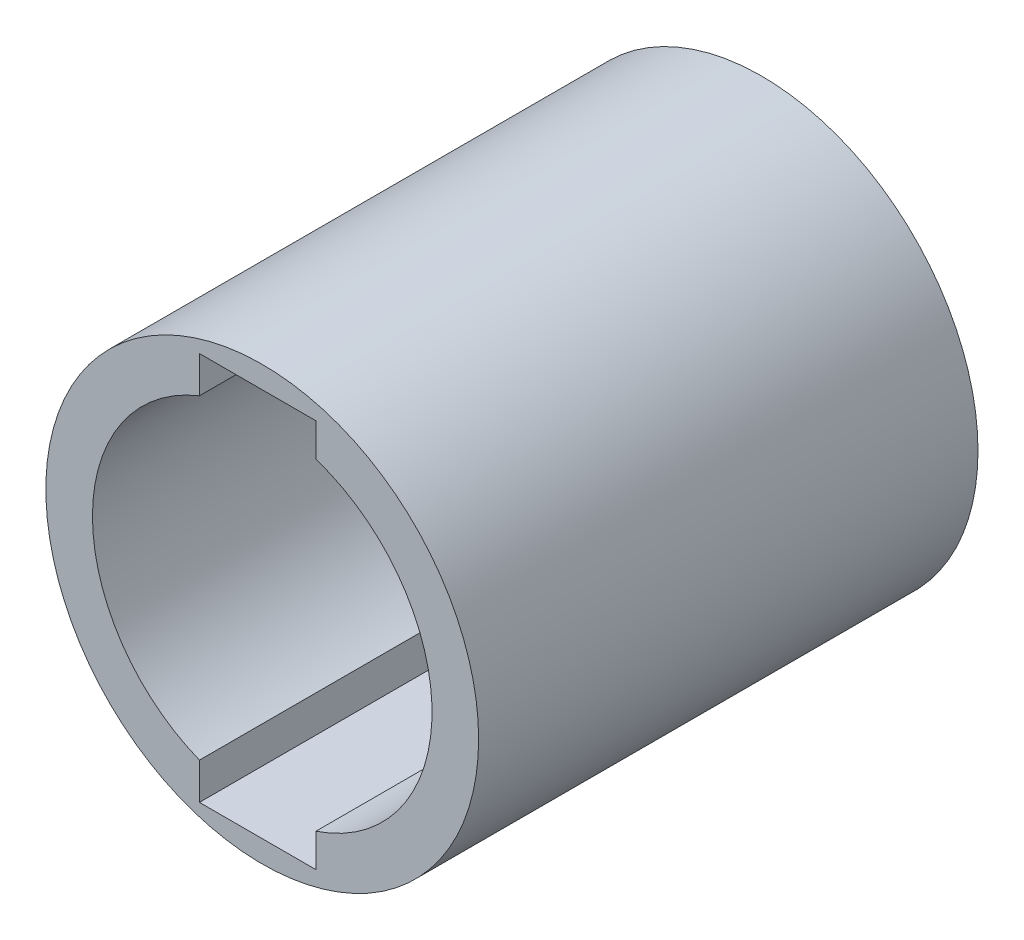
ISO-10303-21;
HEADER;
FILE_DESCRIPTION(('STEP AP214'),'2;1');
FILE_NAME('part.step','',(''),(''),'','','');
FILE_SCHEMA(('AUTOMOTIVE_DESIGN { 1 0 10303 214 1 1 1 1 }'));
ENDSEC;
DATA;
#1=APPLICATION_CONTEXT('core data for automotive mechanical design processes');
#2=APPLICATION_PROTOCOL_DEFINITION('international standard','automotive_design',2000,#1);
#3=PRODUCT_CONTEXT('',#1,'mechanical');
#4=PRODUCT('Part','Part','',(#3));
#5=PRODUCT_RELATED_PRODUCT_CATEGORY('part','',(#4));
#6=PRODUCT_DEFINITION_FORMATION('','',#4);
#7=PRODUCT_DEFINITION_CONTEXT('part definition',#1,'design');
#8=PRODUCT_DEFINITION('design','',#6,#7);
#9=PRODUCT_DEFINITION_SHAPE('','',#8);
#10=(LENGTH_UNIT() NAMED_UNIT(*) SI_UNIT(.MILLI.,.METRE.));
#11=(NAMED_UNIT(*) PLANE_ANGLE_UNIT() SI_UNIT($,.RADIAN.));
#12=(NAMED_UNIT(*) SI_UNIT($,.STERADIAN.) SOLID_ANGLE_UNIT());
#13=UNCERTAINTY_MEASURE_WITH_UNIT(LENGTH_MEASURE(1.E-05),#10,'distance_accuracy_value','');
#14=(GEOMETRIC_REPRESENTATION_CONTEXT(3) GLOBAL_UNCERTAINTY_ASSIGNED_CONTEXT((#13)) GLOBAL_UNIT_ASSIGNED_CONTEXT((#10,
#11,#12)) REPRESENTATION_CONTEXT('',''));
#15=CARTESIAN_POINT('',(0.,0.,0.));
#16=DIRECTION('',(0.,0.,1.));
#17=DIRECTION('',(1.,0.,0.));
#18=AXIS2_PLACEMENT_3D('',#15,#16,#17);
#19=CARTESIAN_POINT('',(0.,0.,15.));
#20=DIRECTION('',(0.,0.,-1.));
#21=DIRECTION('',(-1.,0.,0.));
#22=AXIS2_PLACEMENT_3D('',#19,#20,#21);
#23=CYLINDRICAL_SURFACE('',#22,6.5);
#24=CARTESIAN_POINT('',(0.,0.,15.));
#25=DIRECTION('',(0.,0.,1.));
#26=DIRECTION('',(1.,0.,0.));
#27=AXIS2_PLACEMENT_3D('',#24,#25,#26);
#28=CIRCLE('',#27,6.5);
#29=CARTESIAN_POINT('',(6.5,0.,15.));
#30=VERTEX_POINT('',#29);
#31=EDGE_CURVE('E11',#30,#30,#28,.T.);
#32=ORIENTED_EDGE('',*,*,#31,.F.);
#33=EDGE_LOOP('',(#32));
#34=FACE_BOUND('',#33,.T.);
#35=CARTESIAN_POINT('',(0.,0.,0.));
#36=DIRECTION('',(0.,0.,1.));
#37=DIRECTION('',(1.,0.,0.));
#38=AXIS2_PLACEMENT_3D('',#35,#36,#37);
#39=CIRCLE('',#38,6.5);
#40=CARTESIAN_POINT('',(6.5,0.,0.));
#41=VERTEX_POINT('',#40);
#42=EDGE_CURVE('E48',#41,#41,#39,.T.);
#43=ORIENTED_EDGE('',*,*,#42,.T.);
#44=EDGE_LOOP('',(#43));
#45=FACE_BOUND('',#44,.T.);
#46=ADVANCED_FACE('F45',(#34,#45),#23,.T.);
#47=CARTESIAN_POINT('',(0.,0.,15.));
#48=DIRECTION('',(0.,0.,1.));
#49=DIRECTION('',(1.,0.,0.));
#50=AXIS2_PLACEMENT_3D('',#47,#48,#49);
#51=PLANE('',#50);
#52=DIRECTION('',(0.,1.,0.));
#53=VECTOR('',#52,1.);
#54=CARTESIAN_POINT('',(1.61259366911181,4.8383407960106,15.));
#55=LINE('',#54,#53);
#56=CARTESIAN_POINT('',(1.61259366911181,4.8383407960106,15.));
#57=VERTEX_POINT('',#56);
#58=CARTESIAN_POINT('',(1.61259366911181,5.8383407960106,15.));
#59=VERTEX_POINT('',#58);
#60=EDGE_CURVE('E60',#57,#59,#55,.T.);
#61=ORIENTED_EDGE('',*,*,#60,.F.);
#62=CARTESIAN_POINT('',(0.,0.,15.));
#63=DIRECTION('',(0.,0.,1.));
#64=DIRECTION('',(1.,0.,0.));
#65=AXIS2_PLACEMENT_3D('',#62,#63,#64);
#66=CIRCLE('',#65,5.1);
#67=CARTESIAN_POINT('',(1.61259366911181,-4.8383407960106,15.));
#68=VERTEX_POINT('',#67);
#69=EDGE_CURVE('E132',#68,#57,#66,.T.);
#70=ORIENTED_EDGE('',*,*,#69,.F.);
#71=DIRECTION('',(0.,1.,0.));
#72=VECTOR('',#71,1.);
#73=CARTESIAN_POINT('',(1.61259366911181,-5.8383407960106,15.));
#74=LINE('',#73,#72);
#75=CARTESIAN_POINT('',(1.61259366911181,-5.8383407960106,15.));
#76=VERTEX_POINT('',#75);
#77=EDGE_CURVE('E136',#76,#68,#74,.T.);
#78=ORIENTED_EDGE('',*,*,#77,.F.);
#79=DIRECTION('',(1.,0.,0.));
#80=VECTOR('',#79,1.);
#81=CARTESIAN_POINT('',(-1.88629968479603,-5.8383407960106,15.));
#82=LINE('',#81,#80);
#83=CARTESIAN_POINT('',(-1.88629968479603,-5.8383407960106,15.));
#84=VERTEX_POINT('',#83);
#85=EDGE_CURVE('E175',#84,#76,#82,.T.);
#86=ORIENTED_EDGE('',*,*,#85,.F.);
#87=DIRECTION('',(0.,-1.,0.));
#88=VECTOR('',#87,1.);
#89=CARTESIAN_POINT('',(-1.88629968479603,-5.8383407960106,15.));
#90=LINE('',#89,#88);
#91=CARTESIAN_POINT('',(-1.88629968479603,-4.7383407960106,15.));
#92=VERTEX_POINT('',#91);
#93=EDGE_CURVE('E171',#92,#84,#90,.T.);
#94=ORIENTED_EDGE('',*,*,#93,.F.);
#95=CARTESIAN_POINT('',(0.,0.,15.));
#96=DIRECTION('',(0.,0.,1.));
#97=DIRECTION('',(1.,0.,0.));
#98=AXIS2_PLACEMENT_3D('',#95,#96,#97);
#99=CIRCLE('',#98,5.1);
#100=CARTESIAN_POINT('',(-1.88629968479603,4.7383407960106,15.));
#101=VERTEX_POINT('',#100);
#102=EDGE_CURVE('E167',#101,#92,#99,.T.);
#103=ORIENTED_EDGE('',*,*,#102,.F.);
#104=DIRECTION('',(0.,-1.,0.));
#105=VECTOR('',#104,1.);
#106=CARTESIAN_POINT('',(-1.88629968479603,4.7383407960106,15.));
#107=LINE('',#106,#105);
#108=CARTESIAN_POINT('',(-1.88629968479603,5.8383407960106,15.));
#109=VERTEX_POINT('',#108);
#110=EDGE_CURVE('E163',#109,#101,#107,.T.);
#111=ORIENTED_EDGE('',*,*,#110,.F.);
#112=DIRECTION('',(-1.,0.,0.));
#113=VECTOR('',#112,1.);
#114=CARTESIAN_POINT('',(-1.88629968479603,5.8383407960106,15.));
#115=LINE('',#114,#113);
#116=EDGE_CURVE('E160',#59,#109,#115,.T.);
#117=ORIENTED_EDGE('',*,*,#116,.F.);
#118=EDGE_LOOP('',(#61,#70,#78,#86,#94,#103,#111,#117));
#119=FACE_BOUND('',#118,.T.);
#120=ORIENTED_EDGE('',*,*,#31,.T.);
#121=EDGE_LOOP('',(#120));
#122=FACE_BOUND('',#121,.T.);
#123=ADVANCED_FACE('F205',(#119,#122),#51,.T.);
#124=CARTESIAN_POINT('',(0.,0.,0.));
#125=DIRECTION('',(0.,0.,1.));
#126=DIRECTION('',(1.,0.,0.));
#127=AXIS2_PLACEMENT_3D('',#124,#125,#126);
#128=PLANE('',#127);
#129=CARTESIAN_POINT('',(0.,0.,0.));
#130=DIRECTION('',(0.,0.,1.));
#131=DIRECTION('',(1.,0.,0.));
#132=AXIS2_PLACEMENT_3D('',#129,#130,#131);
#133=CIRCLE('',#132,5.1);
#134=CARTESIAN_POINT('',(1.61259366911181,-4.8383407960106,0.));
#135=VERTEX_POINT('',#134);
#136=CARTESIAN_POINT('',(1.61259366911181,4.8383407960106,0.));
#137=VERTEX_POINT('',#136);
#138=EDGE_CURVE('E119',#135,#137,#133,.T.);
#139=ORIENTED_EDGE('',*,*,#138,.T.);
#140=DIRECTION('',(0.,1.,0.));
#141=VECTOR('',#140,1.);
#142=CARTESIAN_POINT('',(1.61259366911181,4.8383407960106,0.));
#143=LINE('',#142,#141);
#144=CARTESIAN_POINT('',(1.61259366911181,5.8383407960106,0.));
#145=VERTEX_POINT('',#144);
#146=EDGE_CURVE('E112',#137,#145,#143,.T.);
#147=ORIENTED_EDGE('',*,*,#146,.T.);
#148=DIRECTION('',(-1.,0.,0.));
#149=VECTOR('',#148,1.);
#150=CARTESIAN_POINT('',(-1.88629968479603,5.8383407960106,0.));
#151=LINE('',#150,#149);
#152=CARTESIAN_POINT('',(-1.88629968479603,5.8383407960106,0.));
#153=VERTEX_POINT('',#152);
#154=EDGE_CURVE('E122',#145,#153,#151,.T.);
#155=ORIENTED_EDGE('',*,*,#154,.T.);
#156=DIRECTION('',(0.,-1.,0.));
#157=VECTOR('',#156,1.);
#158=CARTESIAN_POINT('',(-1.88629968479603,4.7383407960106,0.));
#159=LINE('',#158,#157);
#160=CARTESIAN_POINT('',(-1.88629968479603,4.7383407960106,0.));
#161=VERTEX_POINT('',#160);
#162=EDGE_CURVE('E68',#153,#161,#159,.T.);
#163=ORIENTED_EDGE('',*,*,#162,.T.);
#164=CARTESIAN_POINT('',(0.,0.,0.));
#165=DIRECTION('',(0.,0.,1.));
#166=DIRECTION('',(1.,0.,0.));
#167=AXIS2_PLACEMENT_3D('',#164,#165,#166);
#168=CIRCLE('',#167,5.1);
#169=CARTESIAN_POINT('',(-1.88629968479603,-4.7383407960106,0.));
#170=VERTEX_POINT('',#169);
#171=EDGE_CURVE('E141',#161,#170,#168,.T.);
#172=ORIENTED_EDGE('',*,*,#171,.T.);
#173=DIRECTION('',(0.,-1.,0.));
#174=VECTOR('',#173,1.);
#175=CARTESIAN_POINT('',(-1.88629968479603,-5.8383407960106,0.));
#176=LINE('',#175,#174);
#177=CARTESIAN_POINT('',(-1.88629968479603,-5.8383407960106,0.));
#178=VERTEX_POINT('',#177);
#179=EDGE_CURVE('E145',#170,#178,#176,.T.);
#180=ORIENTED_EDGE('',*,*,#179,.T.);
#181=DIRECTION('',(1.,0.,0.));
#182=VECTOR('',#181,1.);
#183=CARTESIAN_POINT('',(-1.88629968479603,-5.8383407960106,0.));
#184=LINE('',#183,#182);
#185=CARTESIAN_POINT('',(1.61259366911181,-5.8383407960106,0.));
#186=VERTEX_POINT('',#185);
#187=EDGE_CURVE('E149',#178,#186,#184,.T.);
#188=ORIENTED_EDGE('',*,*,#187,.T.);
#189=DIRECTION('',(0.,1.,0.));
#190=VECTOR('',#189,1.);
#191=CARTESIAN_POINT('',(1.61259366911181,-5.8383407960106,0.));
#192=LINE('',#191,#190);
#193=EDGE_CURVE('E153',#186,#135,#192,.T.);
#194=ORIENTED_EDGE('',*,*,#193,.T.);
#195=EDGE_LOOP('',(#139,#147,#155,#163,#172,#180,#188,#194));
#196=FACE_BOUND('',#195,.T.);
#197=ORIENTED_EDGE('',*,*,#42,.F.);
#198=EDGE_LOOP('',(#197));
#199=FACE_BOUND('',#198,.T.);
#200=ADVANCED_FACE('F127',(#196,#199),#128,.F.);
#201=CARTESIAN_POINT('',(1.61259366911181,4.8383407960106,0.));
#202=DIRECTION('',(1.,0.,0.));
#203=DIRECTION('',(0.,1.,0.));
#204=AXIS2_PLACEMENT_3D('',#201,#202,#203);
#205=PLANE('',#204);
#206=ORIENTED_EDGE('',*,*,#60,.T.);
#207=DIRECTION('',(0.,0.,1.));
#208=VECTOR('',#207,1.);
#209=CARTESIAN_POINT('',(1.61259366911181,5.8383407960106,0.));
#210=LINE('',#209,#208);
#211=EDGE_CURVE('E108',#145,#59,#210,.T.);
#212=ORIENTED_EDGE('',*,*,#211,.F.);
#213=ORIENTED_EDGE('',*,*,#146,.F.);
#214=DIRECTION('',(0.,0.,1.));
#215=VECTOR('',#214,1.);
#216=CARTESIAN_POINT('',(1.61259366911181,4.8383407960106,0.));
#217=LINE('',#216,#215);
#218=EDGE_CURVE('E182',#137,#57,#217,.T.);
#219=ORIENTED_EDGE('',*,*,#218,.T.);
#220=EDGE_LOOP('',(#206,#212,#213,#219));
#221=FACE_BOUND('',#220,.T.);
#222=ADVANCED_FACE('F110',(#221),#205,.F.);
#223=CARTESIAN_POINT('',(0.,0.,0.));
#224=DIRECTION('',(0.,0.,1.));
#225=DIRECTION('',(1.,0.,0.));
#226=AXIS2_PLACEMENT_3D('',#223,#224,#225);
#227=CYLINDRICAL_SURFACE('',#226,5.1);
#228=ORIENTED_EDGE('',*,*,#69,.T.);
#229=ORIENTED_EDGE('',*,*,#218,.F.);
#230=ORIENTED_EDGE('',*,*,#138,.F.);
#231=DIRECTION('',(0.,0.,1.));
#232=VECTOR('',#231,1.);
#233=CARTESIAN_POINT('',(1.61259366911181,-4.8383407960106,0.));
#234=LINE('',#233,#232);
#235=EDGE_CURVE('E185',#135,#68,#234,.T.);
#236=ORIENTED_EDGE('',*,*,#235,.T.);
#237=EDGE_LOOP('',(#228,#229,#230,#236));
#238=FACE_BOUND('',#237,.T.);
#239=ADVANCED_FACE('F224',(#238),#227,.F.);
#240=CARTESIAN_POINT('',(1.61259366911181,-5.8383407960106,0.));
#241=DIRECTION('',(1.,0.,0.));
#242=DIRECTION('',(0.,0.,-1.));
#243=AXIS2_PLACEMENT_3D('',#240,#241,#242);
#244=PLANE('',#243);
#245=ORIENTED_EDGE('',*,*,#77,.T.);
#246=ORIENTED_EDGE('',*,*,#235,.F.);
#247=ORIENTED_EDGE('',*,*,#193,.F.);
#248=DIRECTION('',(0.,0.,1.));
#249=VECTOR('',#248,1.);
#250=CARTESIAN_POINT('',(1.61259366911181,-5.8383407960106,0.));
#251=LINE('',#250,#249);
#252=EDGE_CURVE('E188',#186,#76,#251,.T.);
#253=ORIENTED_EDGE('',*,*,#252,.T.);
#254=EDGE_LOOP('',(#245,#246,#247,#253));
#255=FACE_BOUND('',#254,.T.);
#256=ADVANCED_FACE('F221',(#255),#244,.F.);
#257=CARTESIAN_POINT('',(-1.88629968479603,-5.8383407960106,0.));
#258=DIRECTION('',(0.,-1.,0.));
#259=DIRECTION('',(0.,0.,-1.));
#260=AXIS2_PLACEMENT_3D('',#257,#258,#259);
#261=PLANE('',#260);
#262=ORIENTED_EDGE('',*,*,#85,.T.);
#263=ORIENTED_EDGE('',*,*,#252,.F.);
#264=ORIENTED_EDGE('',*,*,#187,.F.);
#265=DIRECTION('',(0.,0.,1.));
#266=VECTOR('',#265,1.);
#267=CARTESIAN_POINT('',(-1.88629968479603,-5.8383407960106,0.));
#268=LINE('',#267,#266);
#269=EDGE_CURVE('E191',#178,#84,#268,.T.);
#270=ORIENTED_EDGE('',*,*,#269,.T.);
#271=EDGE_LOOP('',(#262,#263,#264,#270));
#272=FACE_BOUND('',#271,.T.);
#273=ADVANCED_FACE('F217',(#272),#261,.F.);
#274=CARTESIAN_POINT('',(-1.88629968479603,-5.8383407960106,0.));
#275=DIRECTION('',(-1.,0.,0.));
#276=DIRECTION('',(0.,0.,1.));
#277=AXIS2_PLACEMENT_3D('',#274,#275,#276);
#278=PLANE('',#277);
#279=ORIENTED_EDGE('',*,*,#93,.T.);
#280=ORIENTED_EDGE('',*,*,#269,.F.);
#281=ORIENTED_EDGE('',*,*,#179,.F.);
#282=DIRECTION('',(0.,0.,1.));
#283=VECTOR('',#282,1.);
#284=CARTESIAN_POINT('',(-1.88629968479603,-4.7383407960106,0.));
#285=LINE('',#284,#283);
#286=EDGE_CURVE('E194',#170,#92,#285,.T.);
#287=ORIENTED_EDGE('',*,*,#286,.T.);
#288=EDGE_LOOP('',(#279,#280,#281,#287));
#289=FACE_BOUND('',#288,.T.);
#290=ADVANCED_FACE('F215',(#289),#278,.F.);
#291=CARTESIAN_POINT('',(0.,0.,0.));
#292=DIRECTION('',(0.,0.,1.));
#293=DIRECTION('',(1.,0.,0.));
#294=AXIS2_PLACEMENT_3D('',#291,#292,#293);
#295=CYLINDRICAL_SURFACE('',#294,5.1);
#296=ORIENTED_EDGE('',*,*,#102,.T.);
#297=ORIENTED_EDGE('',*,*,#286,.F.);
#298=ORIENTED_EDGE('',*,*,#171,.F.);
#299=DIRECTION('',(0.,0.,1.));
#300=VECTOR('',#299,1.);
#301=CARTESIAN_POINT('',(-1.88629968479603,4.7383407960106,0.));
#302=LINE('',#301,#300);
#303=EDGE_CURVE('E197',#161,#101,#302,.T.);
#304=ORIENTED_EDGE('',*,*,#303,.T.);
#305=EDGE_LOOP('',(#296,#297,#298,#304));
#306=FACE_BOUND('',#305,.T.);
#307=ADVANCED_FACE('F210',(#306),#295,.F.);
#308=CARTESIAN_POINT('',(-1.88629968479603,4.7383407960106,0.));
#309=DIRECTION('',(-1.,0.,0.));
#310=DIRECTION('',(0.,0.,1.));
#311=AXIS2_PLACEMENT_3D('',#308,#309,#310);
#312=PLANE('',#311);
#313=ORIENTED_EDGE('',*,*,#110,.T.);
#314=ORIENTED_EDGE('',*,*,#303,.F.);
#315=ORIENTED_EDGE('',*,*,#162,.F.);
#316=DIRECTION('',(0.,0.,1.));
#317=VECTOR('',#316,1.);
#318=CARTESIAN_POINT('',(-1.88629968479603,5.8383407960106,0.));
#319=LINE('',#318,#317);
#320=EDGE_CURVE('E118',#153,#109,#319,.T.);
#321=ORIENTED_EDGE('',*,*,#320,.T.);
#322=EDGE_LOOP('',(#313,#314,#315,#321));
#323=FACE_BOUND('',#322,.T.);
#324=ADVANCED_FACE('F201',(#323),#312,.F.);
#325=CARTESIAN_POINT('',(-1.88629968479603,5.8383407960106,0.));
#326=DIRECTION('',(0.,1.,0.));
#327=DIRECTION('',(0.,0.,1.));
#328=AXIS2_PLACEMENT_3D('',#325,#326,#327);
#329=PLANE('',#328);
#330=ORIENTED_EDGE('',*,*,#116,.T.);
#331=ORIENTED_EDGE('',*,*,#320,.F.);
#332=ORIENTED_EDGE('',*,*,#154,.F.);
#333=ORIENTED_EDGE('',*,*,#211,.T.);
#334=EDGE_LOOP('',(#330,#331,#332,#333));
#335=FACE_BOUND('',#334,.T.);
#336=ADVANCED_FACE('F123',(#335),#329,.F.);
#337=CLOSED_SHELL('',(#46,#123,#200,#222,#239,#256,#273,#290,#307,#324,#336));
#338=MANIFOLD_SOLID_BREP('B2',#337);
#339=ADVANCED_BREP_SHAPE_REPRESENTATION('',(#18,#338),#14);
#340=SHAPE_DEFINITION_REPRESENTATION(#9,#339);
ENDSEC;
END-ISO-10303-21;
